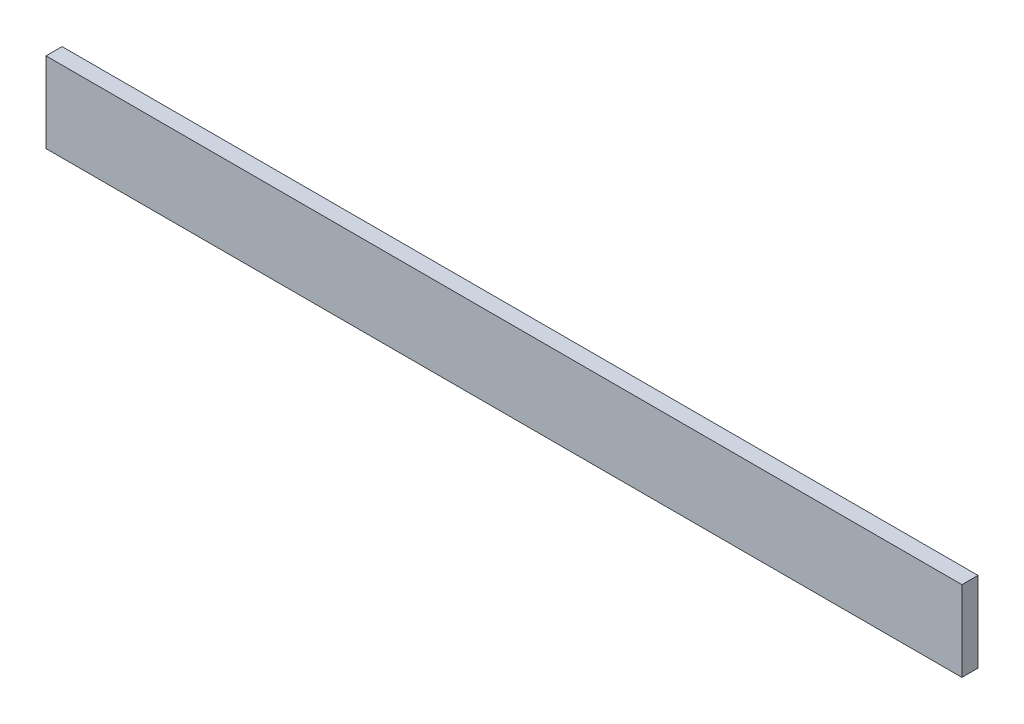
ISO-10303-21;
HEADER;
FILE_DESCRIPTION(('STEP AP214'),'2;1');
FILE_NAME('part.step','',(''),(''),'','','');
FILE_SCHEMA(('AUTOMOTIVE_DESIGN { 1 0 10303 214 1 1 1 1 }'));
ENDSEC;
DATA;
#1=APPLICATION_CONTEXT('core data for automotive mechanical design processes');
#2=APPLICATION_PROTOCOL_DEFINITION('international standard','automotive_design',2000,#1);
#3=PRODUCT_CONTEXT('',#1,'mechanical');
#4=PRODUCT('Part','Part','',(#3));
#5=PRODUCT_RELATED_PRODUCT_CATEGORY('part','',(#4));
#6=PRODUCT_DEFINITION_FORMATION('','',#4);
#7=PRODUCT_DEFINITION_CONTEXT('part definition',#1,'design');
#8=PRODUCT_DEFINITION('design','',#6,#7);
#9=PRODUCT_DEFINITION_SHAPE('','',#8);
#10=(LENGTH_UNIT() NAMED_UNIT(*) SI_UNIT(.MILLI.,.METRE.));
#11=(NAMED_UNIT(*) PLANE_ANGLE_UNIT() SI_UNIT($,.RADIAN.));
#12=(NAMED_UNIT(*) SI_UNIT($,.STERADIAN.) SOLID_ANGLE_UNIT());
#13=UNCERTAINTY_MEASURE_WITH_UNIT(LENGTH_MEASURE(1.E-05),#10,'distance_accuracy_value','');
#14=(GEOMETRIC_REPRESENTATION_CONTEXT(3) GLOBAL_UNCERTAINTY_ASSIGNED_CONTEXT((#13)) GLOBAL_UNIT_ASSIGNED_CONTEXT((#10,
#11,#12)) REPRESENTATION_CONTEXT('',''));
#15=CARTESIAN_POINT('',(0.,0.,0.));
#16=DIRECTION('',(0.,0.,1.));
#17=DIRECTION('',(1.,0.,0.));
#18=AXIS2_PLACEMENT_3D('',#15,#16,#17);
#19=CARTESIAN_POINT('',(0.,0.,12.7));
#20=DIRECTION('',(1.,0.,0.));
#21=DIRECTION('',(0.,0.,-1.));
#22=AXIS2_PLACEMENT_3D('',#19,#20,#21);
#23=PLANE('',#22);
#24=DIRECTION('',(0.,-1.,0.));
#25=VECTOR('',#24,1.);
#26=CARTESIAN_POINT('',(0.,0.,0.));
#27=LINE('',#26,#25);
#28=CARTESIAN_POINT('',(0.,63.5,0.));
#29=VERTEX_POINT('',#28);
#30=CARTESIAN_POINT('',(0.,0.,0.));
#31=VERTEX_POINT('',#30);
#32=EDGE_CURVE('E107',#29,#31,#27,.T.);
#33=ORIENTED_EDGE('',*,*,#32,.T.);
#34=DIRECTION('',(0.,0.,-1.));
#35=VECTOR('',#34,1.);
#36=CARTESIAN_POINT('',(0.,0.,12.7));
#37=LINE('',#36,#35);
#38=CARTESIAN_POINT('',(0.,0.,12.7));
#39=VERTEX_POINT('',#38);
#40=EDGE_CURVE('E11',#39,#31,#37,.T.);
#41=ORIENTED_EDGE('',*,*,#40,.F.);
#42=DIRECTION('',(0.,-1.,0.));
#43=VECTOR('',#42,1.);
#44=CARTESIAN_POINT('',(0.,0.,12.7));
#45=LINE('',#44,#43);
#46=CARTESIAN_POINT('',(0.,63.5,12.7));
#47=VERTEX_POINT('',#46);
#48=EDGE_CURVE('E91',#47,#39,#45,.T.);
#49=ORIENTED_EDGE('',*,*,#48,.F.);
#50=DIRECTION('',(0.,0.,-1.));
#51=VECTOR('',#50,1.);
#52=CARTESIAN_POINT('',(0.,63.5,12.7));
#53=LINE('',#52,#51);
#54=EDGE_CURVE('E103',#47,#29,#53,.T.);
#55=ORIENTED_EDGE('',*,*,#54,.T.);
#56=EDGE_LOOP('',(#33,#41,#49,#55));
#57=FACE_BOUND('',#56,.T.);
#58=ADVANCED_FACE('F39',(#57),#23,.F.);
#59=CARTESIAN_POINT('',(0.,0.,12.7));
#60=DIRECTION('',(0.,1.,0.));
#61=DIRECTION('',(0.,0.,1.));
#62=AXIS2_PLACEMENT_3D('',#59,#60,#61);
#63=PLANE('',#62);
#64=DIRECTION('',(1.,0.,0.));
#65=VECTOR('',#64,1.);
#66=CARTESIAN_POINT('',(0.,0.,0.));
#67=LINE('',#66,#65);
#68=CARTESIAN_POINT('',(723.9,0.,0.));
#69=VERTEX_POINT('',#68);
#70=EDGE_CURVE('E96',#31,#69,#67,.T.);
#71=ORIENTED_EDGE('',*,*,#70,.T.);
#72=DIRECTION('',(0.,0.,-1.));
#73=VECTOR('',#72,1.);
#74=CARTESIAN_POINT('',(723.9,0.,12.7));
#75=LINE('',#74,#73);
#76=CARTESIAN_POINT('',(723.9,0.,12.7));
#77=VERTEX_POINT('',#76);
#78=EDGE_CURVE('E48',#77,#69,#75,.T.);
#79=ORIENTED_EDGE('',*,*,#78,.F.);
#80=DIRECTION('',(1.,0.,0.));
#81=VECTOR('',#80,1.);
#82=CARTESIAN_POINT('',(0.,0.,12.7));
#83=LINE('',#82,#81);
#84=EDGE_CURVE('E86',#39,#77,#83,.T.);
#85=ORIENTED_EDGE('',*,*,#84,.F.);
#86=ORIENTED_EDGE('',*,*,#40,.T.);
#87=EDGE_LOOP('',(#71,#79,#85,#86));
#88=FACE_BOUND('',#87,.T.);
#89=ADVANCED_FACE('F95',(#88),#63,.F.);
#90=CARTESIAN_POINT('',(723.9,0.,12.7));
#91=DIRECTION('',(-1.,0.,0.));
#92=DIRECTION('',(0.,0.,1.));
#93=AXIS2_PLACEMENT_3D('',#90,#91,#92);
#94=PLANE('',#93);
#95=DIRECTION('',(0.,1.,0.));
#96=VECTOR('',#95,1.);
#97=CARTESIAN_POINT('',(723.9,0.,0.));
#98=LINE('',#97,#96);
#99=CARTESIAN_POINT('',(723.9,63.5,0.));
#100=VERTEX_POINT('',#99);
#101=EDGE_CURVE('E73',#69,#100,#98,.T.);
#102=ORIENTED_EDGE('',*,*,#101,.T.);
#103=DIRECTION('',(0.,0.,-1.));
#104=VECTOR('',#103,1.);
#105=CARTESIAN_POINT('',(723.9,63.5,12.7));
#106=LINE('',#105,#104);
#107=CARTESIAN_POINT('',(723.9,63.5,12.7));
#108=VERTEX_POINT('',#107);
#109=EDGE_CURVE('E98',#108,#100,#106,.T.);
#110=ORIENTED_EDGE('',*,*,#109,.F.);
#111=DIRECTION('',(0.,1.,0.));
#112=VECTOR('',#111,1.);
#113=CARTESIAN_POINT('',(723.9,0.,12.7));
#114=LINE('',#113,#112);
#115=EDGE_CURVE('E89',#77,#108,#114,.T.);
#116=ORIENTED_EDGE('',*,*,#115,.F.);
#117=ORIENTED_EDGE('',*,*,#78,.T.);
#118=EDGE_LOOP('',(#102,#110,#116,#117));
#119=FACE_BOUND('',#118,.T.);
#120=ADVANCED_FACE('F99',(#119),#94,.F.);
#121=CARTESIAN_POINT('',(0.,63.5,12.7));
#122=DIRECTION('',(0.,-1.,0.));
#123=DIRECTION('',(0.,0.,-1.));
#124=AXIS2_PLACEMENT_3D('',#121,#122,#123);
#125=PLANE('',#124);
#126=DIRECTION('',(-1.,0.,0.));
#127=VECTOR('',#126,1.);
#128=CARTESIAN_POINT('',(0.,63.5,0.));
#129=LINE('',#128,#127);
#130=EDGE_CURVE('E79',#100,#29,#129,.T.);
#131=ORIENTED_EDGE('',*,*,#130,.T.);
#132=ORIENTED_EDGE('',*,*,#54,.F.);
#133=DIRECTION('',(-1.,0.,0.));
#134=VECTOR('',#133,1.);
#135=CARTESIAN_POINT('',(0.,63.5,12.7));
#136=LINE('',#135,#134);
#137=EDGE_CURVE('E56',#108,#47,#136,.T.);
#138=ORIENTED_EDGE('',*,*,#137,.F.);
#139=ORIENTED_EDGE('',*,*,#109,.T.);
#140=EDGE_LOOP('',(#131,#132,#138,#139));
#141=FACE_BOUND('',#140,.T.);
#142=ADVANCED_FACE('F120',(#141),#125,.F.);
#143=CARTESIAN_POINT('',(0.,0.,12.7));
#144=DIRECTION('',(0.,0.,-1.));
#145=DIRECTION('',(-1.,0.,0.));
#146=AXIS2_PLACEMENT_3D('',#143,#144,#145);
#147=PLANE('',#146);
#148=ORIENTED_EDGE('',*,*,#48,.T.);
#149=ORIENTED_EDGE('',*,*,#84,.T.);
#150=ORIENTED_EDGE('',*,*,#115,.T.);
#151=ORIENTED_EDGE('',*,*,#137,.T.);
#152=EDGE_LOOP('',(#148,#149,#150,#151));
#153=FACE_BOUND('',#152,.T.);
#154=ADVANCED_FACE('F87',(#153),#147,.F.);
#155=CARTESIAN_POINT('',(0.,0.,0.));
#156=DIRECTION('',(0.,0.,-1.));
#157=DIRECTION('',(-1.,0.,0.));
#158=AXIS2_PLACEMENT_3D('',#155,#156,#157);
#159=PLANE('',#158);
#160=ORIENTED_EDGE('',*,*,#32,.F.);
#161=ORIENTED_EDGE('',*,*,#130,.F.);
#162=ORIENTED_EDGE('',*,*,#101,.F.);
#163=ORIENTED_EDGE('',*,*,#70,.F.);
#164=EDGE_LOOP('',(#160,#161,#162,#163));
#165=FACE_BOUND('',#164,.T.);
#166=ADVANCED_FACE('F123',(#165),#159,.T.);
#167=CLOSED_SHELL('',(#58,#89,#120,#142,#154,#166));
#168=MANIFOLD_SOLID_BREP('B2',#167);
#169=ADVANCED_BREP_SHAPE_REPRESENTATION('',(#18,#168),#14);
#170=SHAPE_DEFINITION_REPRESENTATION(#9,#169);
ENDSEC;
END-ISO-10303-21;
